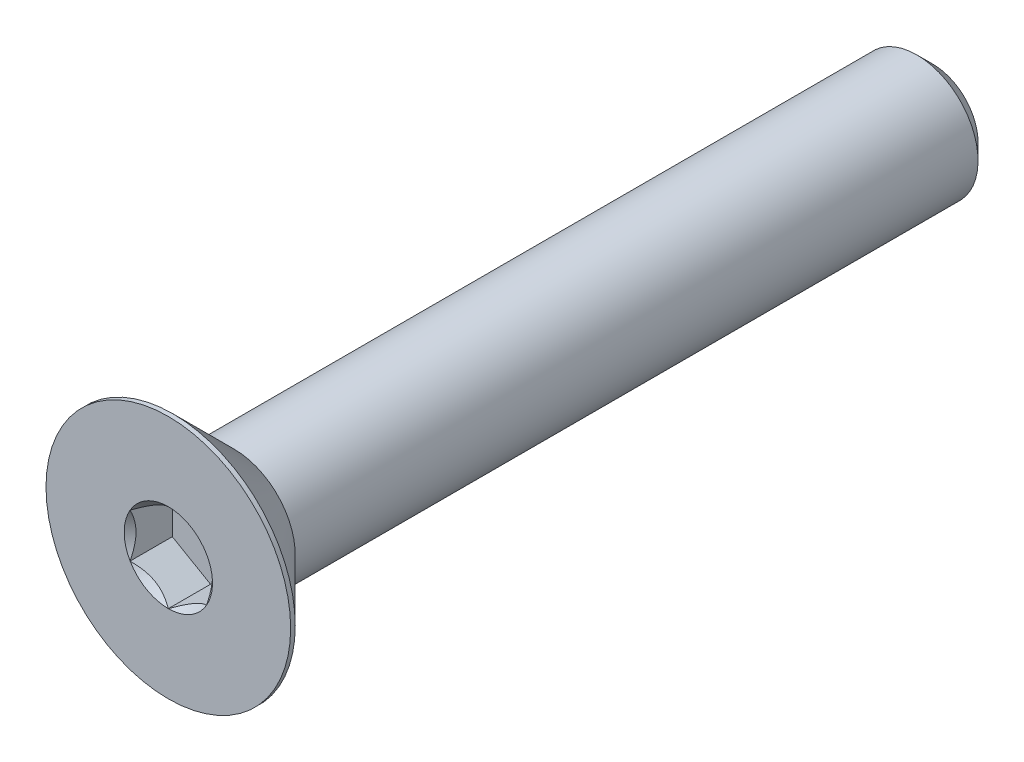
ISO-10303-21;
HEADER;
FILE_DESCRIPTION(('STEP AP214'),'2;1');
FILE_NAME('part.step','',(''),(''),'','','');
FILE_SCHEMA(('AUTOMOTIVE_DESIGN { 1 0 10303 214 1 1 1 1 }'));
ENDSEC;
DATA;
#1=APPLICATION_CONTEXT('core data for automotive mechanical design processes');
#2=APPLICATION_PROTOCOL_DEFINITION('international standard','automotive_design',2000,#1);
#3=PRODUCT_CONTEXT('',#1,'mechanical');
#4=PRODUCT('Part','Part','',(#3));
#5=PRODUCT_RELATED_PRODUCT_CATEGORY('part','',(#4));
#6=PRODUCT_DEFINITION_FORMATION('','',#4);
#7=PRODUCT_DEFINITION_CONTEXT('part definition',#1,'design');
#8=PRODUCT_DEFINITION('design','',#6,#7);
#9=PRODUCT_DEFINITION_SHAPE('','',#8);
#10=(LENGTH_UNIT() NAMED_UNIT(*) SI_UNIT(.MILLI.,.METRE.));
#11=(NAMED_UNIT(*) PLANE_ANGLE_UNIT() SI_UNIT($,.RADIAN.));
#12=(NAMED_UNIT(*) SI_UNIT($,.STERADIAN.) SOLID_ANGLE_UNIT());
#13=UNCERTAINTY_MEASURE_WITH_UNIT(LENGTH_MEASURE(1.E-05),#10,'distance_accuracy_value','');
#14=(GEOMETRIC_REPRESENTATION_CONTEXT(3) GLOBAL_UNCERTAINTY_ASSIGNED_CONTEXT((#13)) GLOBAL_UNIT_ASSIGNED_CONTEXT((#10,
#11,#12)) REPRESENTATION_CONTEXT('',''));
#15=CARTESIAN_POINT('',(0.,0.,0.));
#16=DIRECTION('',(0.,0.,1.));
#17=DIRECTION('',(1.,0.,0.));
#18=AXIS2_PLACEMENT_3D('',#15,#16,#17);
#19=CARTESIAN_POINT('',(0.,0.,2.3));
#20=DIRECTION('',(0.,0.,1.));
#21=DIRECTION('',(0.,-1.,0.));
#22=AXIS2_PLACEMENT_3D('',#19,#20,#21);
#23=PLANE('',#22);
#24=CARTESIAN_POINT('',(0.,0.,2.3));
#25=DIRECTION('',(0.,0.,1.));
#26=DIRECTION('',(1.,0.,0.));
#27=AXIS2_PLACEMENT_3D('',#24,#25,#26);
#28=CIRCLE('',#27,1.44337567297406);
#29=CARTESIAN_POINT('',(0.,-1.44337567297406,2.3));
#30=VERTEX_POINT('',#29);
#31=CARTESIAN_POINT('',(1.24999999999999,-0.721687836487047,2.3));
#32=VERTEX_POINT('',#31);
#33=EDGE_CURVE('E104',#30,#32,#28,.T.);
#34=ORIENTED_EDGE('',*,*,#33,.F.);
#35=CARTESIAN_POINT('',(-1.25,-0.721687836487038,2.3));
#36=VERTEX_POINT('',#35);
#37=EDGE_CURVE('E93',#36,#30,#28,.T.);
#38=ORIENTED_EDGE('',*,*,#37,.F.);
#39=CARTESIAN_POINT('',(-1.25,0.72168783648703,2.3));
#40=VERTEX_POINT('',#39);
#41=EDGE_CURVE('E101',#40,#36,#28,.T.);
#42=ORIENTED_EDGE('',*,*,#41,.F.);
#43=CARTESIAN_POINT('',(0.,1.44337567297406,2.3));
#44=VERTEX_POINT('',#43);
#45=EDGE_CURVE('E53',#44,#40,#28,.T.);
#46=ORIENTED_EDGE('',*,*,#45,.F.);
#47=CARTESIAN_POINT('',(1.25,0.72168783648702,2.3));
#48=VERTEX_POINT('',#47);
#49=EDGE_CURVE('E61',#48,#44,#28,.T.);
#50=ORIENTED_EDGE('',*,*,#49,.F.);
#51=EDGE_CURVE('E132',#32,#48,#28,.T.);
#52=ORIENTED_EDGE('',*,*,#51,.F.);
#53=EDGE_LOOP('',(#34,#38,#42,#46,#50,#52));
#54=FACE_BOUND('',#53,.T.);
#55=CARTESIAN_POINT('',(0.,0.,2.3));
#56=DIRECTION('',(0.,0.,-1.));
#57=DIRECTION('',(0.,1.,0.));
#58=AXIS2_PLACEMENT_3D('',#55,#56,#57);
#59=CIRCLE('',#58,4.);
#60=CARTESIAN_POINT('',(0.,4.,2.3));
#61=VERTEX_POINT('',#60);
#62=EDGE_CURVE('E11',#61,#61,#59,.T.);
#63=ORIENTED_EDGE('',*,*,#62,.F.);
#64=EDGE_LOOP('',(#63));
#65=FACE_BOUND('',#64,.T.);
#66=ADVANCED_FACE('F41',(#54,#65),#23,.T.);
#67=CARTESIAN_POINT('',(0.,0.,-22.7));
#68=DIRECTION('',(0.,0.,-1.));
#69=DIRECTION('',(0.,1.,0.));
#70=AXIS2_PLACEMENT_3D('',#67,#68,#69);
#71=CYLINDRICAL_SURFACE('',#70,4.);
#72=ORIENTED_EDGE('',*,*,#62,.T.);
#73=EDGE_LOOP('',(#72));
#74=FACE_BOUND('',#73,.T.);
#75=CARTESIAN_POINT('',(0.,0.,2.15000000000001));
#76=DIRECTION('',(0.,0.,-1.));
#77=DIRECTION('',(0.,1.,0.));
#78=AXIS2_PLACEMENT_3D('',#75,#76,#77);
#79=CIRCLE('',#78,4.);
#80=CARTESIAN_POINT('',(0.,4.,2.15000000000001));
#81=VERTEX_POINT('',#80);
#82=EDGE_CURVE('E48',#81,#81,#79,.T.);
#83=ORIENTED_EDGE('',*,*,#82,.F.);
#84=EDGE_LOOP('',(#83));
#85=FACE_BOUND('',#84,.T.);
#86=ADVANCED_FACE('F202',(#74,#85),#71,.T.);
#87=CARTESIAN_POINT('',(0.,0.,0.14999999999999));
#88=DIRECTION('',(0.,0.,1.));
#89=DIRECTION('',(0.,-1.,0.));
#90=AXIS2_PLACEMENT_3D('',#87,#88,#89);
#91=CONICAL_SURFACE('',#90,2.,0.785398163397443);
#92=ORIENTED_EDGE('',*,*,#82,.T.);
#93=EDGE_LOOP('',(#92));
#94=FACE_BOUND('',#93,.T.);
#95=CARTESIAN_POINT('',(0.,0.,0.14999999999999));
#96=DIRECTION('',(0.,0.,-1.));
#97=DIRECTION('',(0.,1.,0.));
#98=AXIS2_PLACEMENT_3D('',#95,#96,#97);
#99=CIRCLE('',#98,2.);
#100=CARTESIAN_POINT('',(0.,2.,0.14999999999999));
#101=VERTEX_POINT('',#100);
#102=EDGE_CURVE('E342',#101,#101,#99,.T.);
#103=ORIENTED_EDGE('',*,*,#102,.F.);
#104=EDGE_LOOP('',(#103));
#105=FACE_BOUND('',#104,.T.);
#106=ADVANCED_FACE('F211',(#94,#105),#91,.T.);
#107=CARTESIAN_POINT('',(0.,0.,-22.7));
#108=DIRECTION('',(0.,0.,-1.));
#109=DIRECTION('',(0.,1.,0.));
#110=AXIS2_PLACEMENT_3D('',#107,#108,#109);
#111=CYLINDRICAL_SURFACE('',#110,2.);
#112=ORIENTED_EDGE('',*,*,#102,.T.);
#113=EDGE_LOOP('',(#112));
#114=FACE_BOUND('',#113,.T.);
#115=CARTESIAN_POINT('',(0.,0.,-22.175));
#116=DIRECTION('',(0.,0.,-1.));
#117=DIRECTION('',(0.,1.,0.));
#118=AXIS2_PLACEMENT_3D('',#115,#116,#117);
#119=CIRCLE('',#118,2.);
#120=CARTESIAN_POINT('',(0.,2.,-22.175));
#121=VERTEX_POINT('',#120);
#122=EDGE_CURVE('E339',#121,#121,#119,.T.);
#123=ORIENTED_EDGE('',*,*,#122,.F.);
#124=EDGE_LOOP('',(#123));
#125=FACE_BOUND('',#124,.T.);
#126=ADVANCED_FACE('F218',(#114,#125),#111,.T.);
#127=CARTESIAN_POINT('',(0.,0.,-22.7));
#128=DIRECTION('',(0.,0.,1.));
#129=DIRECTION('',(0.,-1.,0.));
#130=AXIS2_PLACEMENT_3D('',#127,#128,#129);
#131=CONICAL_SURFACE('',#130,1.475,0.785398163397455);
#132=ORIENTED_EDGE('',*,*,#122,.T.);
#133=EDGE_LOOP('',(#132));
#134=FACE_BOUND('',#133,.T.);
#135=CARTESIAN_POINT('',(0.,0.,-22.7));
#136=DIRECTION('',(0.,0.,-1.));
#137=DIRECTION('',(0.,1.,0.));
#138=AXIS2_PLACEMENT_3D('',#135,#136,#137);
#139=CIRCLE('',#138,1.475);
#140=CARTESIAN_POINT('',(0.,1.475,-22.7));
#141=VERTEX_POINT('',#140);
#142=EDGE_CURVE('E326',#141,#141,#139,.T.);
#143=ORIENTED_EDGE('',*,*,#142,.F.);
#144=EDGE_LOOP('',(#143));
#145=FACE_BOUND('',#144,.T.);
#146=ADVANCED_FACE('F225',(#134,#145),#131,.T.);
#147=CARTESIAN_POINT('',(0.,1.475,-22.7));
#148=DIRECTION('',(0.,0.,-1.));
#149=DIRECTION('',(0.,1.,0.));
#150=AXIS2_PLACEMENT_3D('',#147,#148,#149);
#151=PLANE('',#150);
#152=ORIENTED_EDGE('',*,*,#142,.T.);
#153=EDGE_LOOP('',(#152));
#154=FACE_BOUND('',#153,.T.);
#155=ADVANCED_FACE('F227',(#154),#151,.T.);
#156=CARTESIAN_POINT('',(0.,0.,2.3));
#157=DIRECTION('',(0.,0.,1.));
#158=DIRECTION('',(1.,0.,0.));
#159=AXIS2_PLACEMENT_3D('',#156,#157,#158);
#160=CONICAL_SURFACE('',#159,1.44337567297406,0.78539816339745);
#161=ORIENTED_EDGE('',*,*,#33,.T.);
#162=CARTESIAN_POINT('',(-0.000199999999999298,-1.44349114302791,2.30011548390915));
#163=CARTESIAN_POINT('',(0.0427751670715876,-1.41867941875066,2.27532166805511));
#164=CARTESIAN_POINT('',(0.0864690047459491,-1.39345276980744,2.25198373441869));
#165=CARTESIAN_POINT('',(0.175565930841943,-1.34201263554195,2.20925200408455));
#166=CARTESIAN_POINT('',(0.220977498357065,-1.31579425481277,2.18988199236042));
#167=CARTESIAN_POINT('',(0.312547820935262,-1.26292610442247,2.15670048341349));
#168=CARTESIAN_POINT('',(0.358683240175887,-1.23628980770471,2.14280555905267));
#169=CARTESIAN_POINT('',(0.451970080407595,-1.18243062538509,2.12139728216065));
#170=CARTESIAN_POINT('',(0.499118649136382,-1.15520938653762,2.1138679415668));
#171=CARTESIAN_POINT('',(0.580373556887255,-1.10829684367467,2.10707449805071));
#172=CARTESIAN_POINT('',(0.614374876627943,-1.08866617256958,2.10606855910436));
#173=CARTESIAN_POINT('',(0.68231776443248,-1.04943932800611,2.10776141491133));
#174=CARTESIAN_POINT('',(0.71625931765566,-1.029843163116,2.11046102721555));
#175=CARTESIAN_POINT('',(0.783814856457503,-0.990839954603503,2.11940893031639));
#176=CARTESIAN_POINT('',(0.817428507286778,-0.971433104248775,2.12566052589972));
#177=CARTESIAN_POINT('',(0.884094638217817,-0.932943395609909,2.14137568141391));
#178=CARTESIAN_POINT('',(0.917146871030299,-0.913860680098304,2.15084062008747));
#179=CARTESIAN_POINT('',(1.00179969160027,-0.864986351354572,2.1789313906876));
#180=CARTESIAN_POINT('',(1.05286649242964,-0.83550292014908,2.19967015745221));
#181=CARTESIAN_POINT('',(1.15300085411326,-0.777690319475913,2.24638713467148));
#182=CARTESIAN_POINT('',(1.20207431157827,-0.749357745598422,2.27234829594677));
#183=CARTESIAN_POINT('',(1.2502,-0.7215723664332,2.30011548390914));
#184=B_SPLINE_CURVE_WITH_KNOTS('',3,(#162,#163,#164,#165,#166,#167,#168,#169,#170,#171,#172,
#173,#174,#175,#176,#177,#178,#179,#180,#181,#182,#183),.UNSPECIFIED.,.F.,.F.,(4,2,2,2,2,2,2,2,
2,2,4),(0.,0.166533409618304,0.334037607289763,0.4988803964897,0.663307919240276,
0.780963963458829,0.898645970148456,1.01643764860774,1.1342799317155,1.32148652032141,
1.50809158792574),.UNSPECIFIED.);
#185=EDGE_CURVE('E107',#30,#32,#184,.T.);
#186=ORIENTED_EDGE('',*,*,#185,.F.);
#187=EDGE_LOOP('',(#161,#186));
#188=FACE_BOUND('',#187,.T.);
#189=ADVANCED_FACE('F109',(#188),#160,.F.);
#190=ORIENTED_EDGE('',*,*,#51,.T.);
#191=CARTESIAN_POINT('',(1.25,-1.44558559085168,2.76770195508766));
#192=CARTESIAN_POINT('',(1.25,-1.41041456421273,2.74110177846586));
#193=CARTESIAN_POINT('',(1.25,-1.375048246278,2.71476055449202));
#194=CARTESIAN_POINT('',(1.25,-1.30384550652843,2.66270312278429));
#195=CARTESIAN_POINT('',(1.25,-1.26800896958643,2.63698707268499));
#196=CARTESIAN_POINT('',(1.25,-1.15915024976603,2.56057047994769));
#197=CARTESIAN_POINT('',(1.25,-1.0853135555352,2.51101105414595));
#198=CARTESIAN_POINT('',(1.25,-0.930440480136245,2.41366267450988));
#199=CARTESIAN_POINT('',(1.25,-0.849234447842946,2.36614057378199));
#200=CARTESIAN_POINT('',(1.25,-0.682758358155013,2.27917251766336));
#201=CARTESIAN_POINT('',(1.25,-0.597503250727505,2.23969932800442));
#202=CARTESIAN_POINT('',(1.25,-0.469594358717527,2.19140566309066));
#203=CARTESIAN_POINT('',(1.25,-0.428847517514854,2.17755553704108));
#204=CARTESIAN_POINT('',(1.25,-0.346364670497222,2.15312581626434));
#205=CARTESIAN_POINT('',(1.25,-0.304628597273696,2.14254644510785));
#206=CARTESIAN_POINT('',(1.25,-0.221117022160186,2.12538571480318));
#207=CARTESIAN_POINT('',(1.25,-0.179355899882148,2.11873547434159));
#208=CARTESIAN_POINT('',(1.25,-0.095380156628225,2.10956385515197));
#209=CARTESIAN_POINT('',(1.25,-0.0531656163345118,2.10704175371567));
#210=CARTESIAN_POINT('',(1.25,0.0297411153276122,2.10631616273595));
#211=CARTESIAN_POINT('',(1.25,0.0704319929081055,2.10795672790788));
#212=CARTESIAN_POINT('',(1.25,0.151471929245862,2.11512087453646));
#213=CARTESIAN_POINT('',(1.25,0.191820921364253,2.12064519614476));
#214=CARTESIAN_POINT('',(1.25,0.272562320711496,2.13536794868554));
#215=CARTESIAN_POINT('',(1.25,0.312943142675219,2.14462895456776));
#216=CARTESIAN_POINT('',(1.25,0.392821680655096,2.16633099691958));
#217=CARTESIAN_POINT('',(1.25,0.432319468115639,2.17877177510079));
#218=CARTESIAN_POINT('',(1.25,0.556389803393322,2.22253839960481));
#219=CARTESIAN_POINT('',(1.25,0.63920381751649,2.25883695565282));
#220=CARTESIAN_POINT('',(1.25,0.800943973860687,2.33955043113924));
#221=CARTESIAN_POINT('',(1.25,0.879854844337737,2.38399445277655));
#222=CARTESIAN_POINT('',(1.25,1.03066900695341,2.47569512396586));
#223=CARTESIAN_POINT('',(1.25,1.10272570486019,2.52270260556435));
#224=CARTESIAN_POINT('',(1.25,1.2088866162029,2.59537504737116));
#225=CARTESIAN_POINT('',(1.25,1.2438155557312,2.61985615718635));
#226=CARTESIAN_POINT('',(1.25,1.31319594254627,2.66946685288608));
#227=CARTESIAN_POINT('',(1.25,1.34764751766826,2.69459625979218));
#228=CARTESIAN_POINT('',(1.25,1.38190028539499,2.71999449926085));
#229=B_SPLINE_CURVE_WITH_KNOTS('',3,(#191,#192,#193,#194,#195,#196,#197,#198,#199,#200,#201,
#202,#203,#204,#205,#206,#207,#208,#209,#210,#211,#212,#213,#214,#215,#216,#217,#218,#219,#220,
#221,#222,#223,#224,#225,#226,#227,#228),.UNSPECIFIED.,.F.,.F.,(4,2,2,2,2,2,2,2,2,2,2,2,2,2,2,2,
2,2,4),(0.,0.132288510820274,0.264610038672127,0.531272225402128,0.813310106763961,
1.09437724330802,1.22337738425307,1.35238634098375,1.47906083498915,1.60571314987258,
1.72769130094315,1.84969270445304,1.97382807612636,2.09795336766269,2.36841755380881,
2.63986759286266,2.89784160186214,3.02579840704267,3.15372025683404),.UNSPECIFIED.);
#230=EDGE_CURVE('E112',#32,#48,#229,.T.);
#231=ORIENTED_EDGE('',*,*,#230,.F.);
#232=EDGE_LOOP('',(#190,#231));
#233=FACE_BOUND('',#232,.T.);
#234=ADVANCED_FACE('F277',(#233),#160,.F.);
#235=ORIENTED_EDGE('',*,*,#49,.T.);
#236=CARTESIAN_POINT('',(1.2502,0.721572366433189,2.30011548390914));
#237=CARTESIAN_POINT('',(1.20722483292841,0.746384090710439,2.27532166805511));
#238=CARTESIAN_POINT('',(1.16353099525405,0.771610739653659,2.25198373441869));
#239=CARTESIAN_POINT('',(1.07443406915806,0.823050873919149,2.20925200408454));
#240=CARTESIAN_POINT('',(1.02902250164294,0.849269254648328,2.18988199236042));
#241=CARTESIAN_POINT('',(0.93745217906474,0.902137405038631,2.15670048341348));
#242=CARTESIAN_POINT('',(0.891316759824114,0.928773701756382,2.14280555905266));
#243=CARTESIAN_POINT('',(0.798029919592407,0.982632884076008,2.12139728216064));
#244=CARTESIAN_POINT('',(0.75088135086362,1.00985412292348,2.11386794156679));
#245=CARTESIAN_POINT('',(0.669626443112747,1.05676666578642,2.1070744980507));
#246=CARTESIAN_POINT('',(0.635625123372059,1.07639733689151,2.10606855910435));
#247=CARTESIAN_POINT('',(0.567682235567522,1.11562418145498,2.10776141491132));
#248=CARTESIAN_POINT('',(0.533740682344342,1.1352203463451,2.11046102721554));
#249=CARTESIAN_POINT('',(0.4661851435425,1.17422355485759,2.11940893031638));
#250=CARTESIAN_POINT('',(0.432571492713225,1.19363040521232,2.12566052589971));
#251=CARTESIAN_POINT('',(0.365905361782187,1.23212011385119,2.1413756814139));
#252=CARTESIAN_POINT('',(0.332853128969705,1.25120282936279,2.15084062008746));
#253=CARTESIAN_POINT('',(0.248200308399736,1.30007715810652,2.17893139068759));
#254=CARTESIAN_POINT('',(0.197133507570362,1.32956058931202,2.1996701574522));
#255=CARTESIAN_POINT('',(0.0969991458867458,1.38737318998518,2.24638713467148));
#256=CARTESIAN_POINT('',(0.0479256884217311,1.41570576386268,2.27234829594677));
#257=CARTESIAN_POINT('',(-0.000199999999999493,1.4434911430279,2.30011548390914));
#258=B_SPLINE_CURVE_WITH_KNOTS('',3,(#236,#237,#238,#239,#240,#241,#242,#243,#244,#245,#246,
#247,#248,#249,#250,#251,#252,#253,#254,#255,#256,#257),.UNSPECIFIED.,.F.,.F.,(4,2,2,2,2,2,2,2,
2,2,4),(0.,0.166533409618304,0.334037607289763,0.4988803964897,0.663307919240277,
0.780963963458829,0.898645970148455,1.01643764860773,1.1342799317155,1.32148652032141,
1.50809158792574),.UNSPECIFIED.);
#259=EDGE_CURVE('E162',#48,#44,#258,.T.);
#260=ORIENTED_EDGE('',*,*,#259,.F.);
#261=EDGE_LOOP('',(#235,#260));
#262=FACE_BOUND('',#261,.T.);
#263=ADVANCED_FACE('F282',(#262),#160,.F.);
#264=ORIENTED_EDGE('',*,*,#45,.T.);
#265=CARTESIAN_POINT('',(0.000200000000000505,1.4434911430279,2.30011548390914));
#266=CARTESIAN_POINT('',(-0.0427751670715859,1.41867941875065,2.2753216680551));
#267=CARTESIAN_POINT('',(-0.0864690047459471,1.39345276980743,2.25198373441868));
#268=CARTESIAN_POINT('',(-0.175565930841941,1.34201263554194,2.20925200408454));
#269=CARTESIAN_POINT('',(-0.220977498357063,1.31579425481276,2.18988199236041));
#270=CARTESIAN_POINT('',(-0.312547820935258,1.26292610442246,2.15670048341348));
#271=CARTESIAN_POINT('',(-0.358683240175884,1.23628980770471,2.14280555905266));
#272=CARTESIAN_POINT('',(-0.45197008040759,1.18243062538508,2.12139728216064));
#273=CARTESIAN_POINT('',(-0.499118649136378,1.15520938653761,2.11386794156679));
#274=CARTESIAN_POINT('',(-0.58037355688725,1.10829684367466,2.1070744980507));
#275=CARTESIAN_POINT('',(-0.614374876627938,1.08866617256958,2.10606855910435));
#276=CARTESIAN_POINT('',(-0.682317764432475,1.04943932800611,2.10776141491132));
#277=CARTESIAN_POINT('',(-0.716259317655655,1.02984316311599,2.11046102721554));
#278=CARTESIAN_POINT('',(-0.783814856457496,0.990839954603496,2.11940893031638));
#279=CARTESIAN_POINT('',(-0.817428507286771,0.971433104248768,2.12566052589971));
#280=CARTESIAN_POINT('',(-0.884094638217809,0.932943395609902,2.1413756814139));
#281=CARTESIAN_POINT('',(-0.917146871030292,0.913860680098297,2.15084062008746));
#282=CARTESIAN_POINT('',(-1.00179969160026,0.864986351354564,2.17893139068759));
#283=CARTESIAN_POINT('',(-1.05286649242964,0.835502920149072,2.1996701574522));
#284=CARTESIAN_POINT('',(-1.15300085411325,0.777690319475905,2.24638713467148));
#285=CARTESIAN_POINT('',(-1.20207431157827,0.749357745598413,2.27234829594677));
#286=CARTESIAN_POINT('',(-1.2502,0.72157236643319,2.30011548390914));
#287=B_SPLINE_CURVE_WITH_KNOTS('',3,(#265,#266,#267,#268,#269,#270,#271,#272,#273,#274,#275,
#276,#277,#278,#279,#280,#281,#282,#283,#284,#285,#286),.UNSPECIFIED.,.F.,.F.,(4,2,2,2,2,2,2,2,
2,2,4),(0.,0.166533409618303,0.33403760728976,0.498880396489696,0.663307919240272,
0.780963963458824,0.89864597014845,1.01643764860773,1.13427993171549,1.32148652032141,
1.50809158792573),.UNSPECIFIED.);
#288=EDGE_CURVE('E169',#44,#40,#287,.T.);
#289=ORIENTED_EDGE('',*,*,#288,.F.);
#290=EDGE_LOOP('',(#264,#289));
#291=FACE_BOUND('',#290,.T.);
#292=ADVANCED_FACE('F295',(#291),#160,.F.);
#293=ORIENTED_EDGE('',*,*,#41,.T.);
#294=CARTESIAN_POINT('',(-1.25,-1.44558559085168,2.76770195508766));
#295=CARTESIAN_POINT('',(-1.25,-1.41041456421273,2.74110177846586));
#296=CARTESIAN_POINT('',(-1.25,-1.37504824627801,2.71476055449202));
#297=CARTESIAN_POINT('',(-1.25,-1.30384550652843,2.66270312278429));
#298=CARTESIAN_POINT('',(-1.25,-1.26800896958644,2.63698707268499));
#299=CARTESIAN_POINT('',(-1.25,-1.15915024976603,2.56057047994769));
#300=CARTESIAN_POINT('',(-1.25,-1.0853135555352,2.51101105414595));
#301=CARTESIAN_POINT('',(-1.25,-0.930440480136247,2.41366267450988));
#302=CARTESIAN_POINT('',(-1.25,-0.849234447842947,2.36614057378199));
#303=CARTESIAN_POINT('',(-1.25,-0.682758358155014,2.27917251766336));
#304=CARTESIAN_POINT('',(-1.25,-0.597503250727506,2.23969932800442));
#305=CARTESIAN_POINT('',(-1.25,-0.469594358717527,2.19140566309066));
#306=CARTESIAN_POINT('',(-1.25,-0.428847517514855,2.17755553704108));
#307=CARTESIAN_POINT('',(-1.25,-0.346364670497223,2.15312581626434));
#308=CARTESIAN_POINT('',(-1.25,-0.304628597273696,2.14254644510784));
#309=CARTESIAN_POINT('',(-1.25,-0.221117022160187,2.12538571480318));
#310=CARTESIAN_POINT('',(-1.25,-0.179355899882149,2.11873547434159));
#311=CARTESIAN_POINT('',(-1.25,-0.0953801566282258,2.10956385515197));
#312=CARTESIAN_POINT('',(-1.25,-0.0531656163345126,2.10704175371567));
#313=CARTESIAN_POINT('',(-1.25,0.0297411153276114,2.10631616273595));
#314=CARTESIAN_POINT('',(-1.25,0.0704319929081049,2.10795672790787));
#315=CARTESIAN_POINT('',(-1.25,0.151471929245861,2.11512087453645));
#316=CARTESIAN_POINT('',(-1.25,0.191820921364252,2.12064519614475));
#317=CARTESIAN_POINT('',(-1.25,0.272562320711495,2.13536794868554));
#318=CARTESIAN_POINT('',(-1.25,0.312943142675218,2.14462895456776));
#319=CARTESIAN_POINT('',(-1.25,0.392821680655095,2.16633099691957));
#320=CARTESIAN_POINT('',(-1.25,0.432319468115638,2.17877177510079));
#321=CARTESIAN_POINT('',(-1.25,0.556389803393322,2.2225383996048));
#322=CARTESIAN_POINT('',(-1.25,0.639203817516489,2.25883695565282));
#323=CARTESIAN_POINT('',(-1.25,0.800943973860685,2.33955043113924));
#324=CARTESIAN_POINT('',(-1.25,0.879854844337736,2.38399445277655));
#325=CARTESIAN_POINT('',(-1.25,1.03066900695341,2.47569512396586));
#326=CARTESIAN_POINT('',(-1.25,1.10272570486019,2.52270260556435));
#327=CARTESIAN_POINT('',(-1.25,1.20888661620289,2.59537504737116));
#328=CARTESIAN_POINT('',(-1.25,1.24381555573119,2.61985615718635));
#329=CARTESIAN_POINT('',(-1.25,1.31319594254627,2.66946685288607));
#330=CARTESIAN_POINT('',(-1.25,1.34764751766826,2.69459625979218));
#331=CARTESIAN_POINT('',(-1.25,1.38190028539498,2.71999449926084));
#332=B_SPLINE_CURVE_WITH_KNOTS('',3,(#294,#295,#296,#297,#298,#299,#300,#301,#302,#303,#304,
#305,#306,#307,#308,#309,#310,#311,#312,#313,#314,#315,#316,#317,#318,#319,#320,#321,#322,#323,
#324,#325,#326,#327,#328,#329,#330,#331),.UNSPECIFIED.,.F.,.F.,(4,2,2,2,2,2,2,2,2,2,2,2,2,2,2,2,
2,2,4),(0.,0.132288510820275,0.264610038672127,0.531272225402128,0.813310106763961,
1.09437724330802,1.22337738425308,1.35238634098375,1.47906083498915,1.60571314987258,
1.72769130094315,1.84969270445304,1.97382807612636,2.09795336766269,2.36841755380881,
2.63986759286266,2.89784160186214,3.02579840704267,3.15372025683404),.UNSPECIFIED.);
#333=EDGE_CURVE('E121',#40,#36,#332,.F.);
#334=ORIENTED_EDGE('',*,*,#333,.F.);
#335=EDGE_LOOP('',(#293,#334));
#336=FACE_BOUND('',#335,.T.);
#337=ADVANCED_FACE('F152',(#336),#160,.F.);
#338=ORIENTED_EDGE('',*,*,#37,.T.);
#339=CARTESIAN_POINT('',(-1.2502,-0.7215723664332,2.30011548390914));
#340=CARTESIAN_POINT('',(-1.20722483292841,-0.74638409071045,2.27532166805511));
#341=CARTESIAN_POINT('',(-1.16353099525405,-0.77161073965367,2.25198373441869));
#342=CARTESIAN_POINT('',(-1.07443406915806,-0.82305087391916,2.20925200408454));
#343=CARTESIAN_POINT('',(-1.02902250164294,-0.849269254648338,2.18988199236042));
#344=CARTESIAN_POINT('',(-0.93745217906474,-0.902137405038641,2.15670048341349));
#345=CARTESIAN_POINT('',(-0.891316759824115,-0.928773701756392,2.14280555905267));
#346=CARTESIAN_POINT('',(-0.798029919592408,-0.982632884076017,2.12139728216065));
#347=CARTESIAN_POINT('',(-0.750881350863621,-1.00985412292349,2.1138679415668));
#348=CARTESIAN_POINT('',(-0.669626443112749,-1.05676666578643,2.10707449805071));
#349=CARTESIAN_POINT('',(-0.63562512337206,-1.07639733689152,2.10606855910436));
#350=CARTESIAN_POINT('',(-0.567682235567523,-1.11562418145499,2.10776141491133));
#351=CARTESIAN_POINT('',(-0.533740682344343,-1.13522034634511,2.11046102721555));
#352=CARTESIAN_POINT('',(-0.466185143542501,-1.1742235548576,2.11940893031639));
#353=CARTESIAN_POINT('',(-0.432571492713225,-1.19363040521233,2.12566052589972));
#354=CARTESIAN_POINT('',(-0.365905361782187,-1.2321201138512,2.14137568141391));
#355=CARTESIAN_POINT('',(-0.332853128969704,-1.2512028293628,2.15084062008747));
#356=CARTESIAN_POINT('',(-0.248200308399735,-1.30007715810653,2.1789313906876));
#357=CARTESIAN_POINT('',(-0.197133507570361,-1.32956058931203,2.19967015745221));
#358=CARTESIAN_POINT('',(-0.0969991458867445,-1.38737318998519,2.24638713467149));
#359=CARTESIAN_POINT('',(-0.0479256884217297,-1.41570576386269,2.27234829594678));
#360=CARTESIAN_POINT('',(0.000200000000000935,-1.44349114302791,2.30011548390915));
#361=B_SPLINE_CURVE_WITH_KNOTS('',3,(#339,#340,#341,#342,#343,#344,#345,#346,#347,#348,#349,
#350,#351,#352,#353,#354,#355,#356,#357,#358,#359,#360),.UNSPECIFIED.,.F.,.F.,(4,2,2,2,2,2,2,2,
2,2,4),(0.,0.166533409618303,0.33403760728976,0.498880396489696,0.663307919240271,
0.780963963458824,0.898645970148451,1.01643764860773,1.13427993171549,1.32148652032141,
1.50809158792574),.UNSPECIFIED.);
#362=EDGE_CURVE('E96',#36,#30,#361,.T.);
#363=ORIENTED_EDGE('',*,*,#362,.F.);
#364=EDGE_LOOP('',(#338,#363));
#365=FACE_BOUND('',#364,.T.);
#366=ADVANCED_FACE('F98',(#365),#160,.F.);
#367=CARTESIAN_POINT('',(0.,-1.44337567297407,0.92));
#368=DIRECTION('',(0.,0.,1.));
#369=DIRECTION('',(1.,0.,0.));
#370=AXIS2_PLACEMENT_3D('',#367,#368,#369);
#371=PLANE('',#370);
#372=DIRECTION('',(0.866025403784439,-0.5,0.));
#373=VECTOR('',#372,1.);
#374=CARTESIAN_POINT('',(-1.25,-0.721687836487038,0.92));
#375=LINE('',#374,#373);
#376=CARTESIAN_POINT('',(-1.25,-0.721687836487038,0.92));
#377=VERTEX_POINT('',#376);
#378=CARTESIAN_POINT('',(0.,-1.44337567297407,0.92));
#379=VERTEX_POINT('',#378);
#380=EDGE_CURVE('E124',#377,#379,#375,.T.);
#381=ORIENTED_EDGE('',*,*,#380,.T.);
#382=DIRECTION('',(0.866025403784439,0.5,0.));
#383=VECTOR('',#382,1.);
#384=CARTESIAN_POINT('',(0.,-1.44337567297407,0.92));
#385=LINE('',#384,#383);
#386=CARTESIAN_POINT('',(1.25,-0.721687836487038,0.92));
#387=VERTEX_POINT('',#386);
#388=EDGE_CURVE('E129',#379,#387,#385,.T.);
#389=ORIENTED_EDGE('',*,*,#388,.T.);
#390=DIRECTION('',(0.,1.,0.));
#391=VECTOR('',#390,1.);
#392=CARTESIAN_POINT('',(1.25,-0.721687836487038,0.92));
#393=LINE('',#392,#391);
#394=CARTESIAN_POINT('',(1.25,0.721687836487027,0.92));
#395=VERTEX_POINT('',#394);
#396=EDGE_CURVE('E352',#387,#395,#393,.T.);
#397=ORIENTED_EDGE('',*,*,#396,.T.);
#398=DIRECTION('',(-0.866025403784438,0.5,0.));
#399=VECTOR('',#398,1.);
#400=CARTESIAN_POINT('',(1.25,0.721687836487027,0.92));
#401=LINE('',#400,#399);
#402=CARTESIAN_POINT('',(0.,1.44337567297406,0.92));
#403=VERTEX_POINT('',#402);
#404=EDGE_CURVE('E356',#395,#403,#401,.T.);
#405=ORIENTED_EDGE('',*,*,#404,.T.);
#406=DIRECTION('',(-0.866025403784439,-0.5,0.));
#407=VECTOR('',#406,1.);
#408=CARTESIAN_POINT('',(0.,1.44337567297406,0.92));
#409=LINE('',#408,#407);
#410=CARTESIAN_POINT('',(-1.25,0.721687836487028,0.92));
#411=VERTEX_POINT('',#410);
#412=EDGE_CURVE('E361',#403,#411,#409,.T.);
#413=ORIENTED_EDGE('',*,*,#412,.T.);
#414=DIRECTION('',(0.,-1.,0.));
#415=VECTOR('',#414,1.);
#416=CARTESIAN_POINT('',(-1.25,0.721687836487028,0.92));
#417=LINE('',#416,#415);
#418=EDGE_CURVE('E133',#411,#377,#417,.T.);
#419=ORIENTED_EDGE('',*,*,#418,.T.);
#420=EDGE_LOOP('',(#381,#389,#397,#405,#413,#419));
#421=FACE_BOUND('',#420,.T.);
#422=ADVANCED_FACE('F154',(#421),#371,.T.);
#423=CARTESIAN_POINT('',(0.,-1.44337567297407,0.92));
#424=DIRECTION('',(0.5,-0.866025403784439,0.));
#425=DIRECTION('',(0.866025403784439,0.5,0.));
#426=AXIS2_PLACEMENT_3D('',#423,#424,#425);
#427=PLANE('',#426);
#428=DIRECTION('',(0.,0.,1.));
#429=VECTOR('',#428,1.);
#430=CARTESIAN_POINT('',(0.,-1.44337567297407,0.92));
#431=LINE('',#430,#429);
#432=EDGE_CURVE('E118',#379,#30,#431,.T.);
#433=ORIENTED_EDGE('',*,*,#432,.T.);
#434=ORIENTED_EDGE('',*,*,#185,.T.);
#435=DIRECTION('',(0.,0.,1.));
#436=VECTOR('',#435,1.);
#437=CARTESIAN_POINT('',(1.25,-0.721687836487038,0.92));
#438=LINE('',#437,#436);
#439=EDGE_CURVE('E130',#387,#32,#438,.T.);
#440=ORIENTED_EDGE('',*,*,#439,.F.);
#441=ORIENTED_EDGE('',*,*,#388,.F.);
#442=EDGE_LOOP('',(#433,#434,#440,#441));
#443=FACE_BOUND('',#442,.T.);
#444=ADVANCED_FACE('F126',(#443),#427,.F.);
#445=CARTESIAN_POINT('',(1.25,-0.721687836487038,0.92));
#446=DIRECTION('',(1.,0.,0.));
#447=DIRECTION('',(0.,0.,-1.));
#448=AXIS2_PLACEMENT_3D('',#445,#446,#447);
#449=PLANE('',#448);
#450=ORIENTED_EDGE('',*,*,#439,.T.);
#451=ORIENTED_EDGE('',*,*,#230,.T.);
#452=DIRECTION('',(0.,0.,1.));
#453=VECTOR('',#452,1.);
#454=CARTESIAN_POINT('',(1.25,0.721687836487027,0.92));
#455=LINE('',#454,#453);
#456=EDGE_CURVE('E327',#395,#48,#455,.T.);
#457=ORIENTED_EDGE('',*,*,#456,.F.);
#458=ORIENTED_EDGE('',*,*,#396,.F.);
#459=EDGE_LOOP('',(#450,#451,#457,#458));
#460=FACE_BOUND('',#459,.T.);
#461=ADVANCED_FACE('F198',(#460),#449,.F.);
#462=CARTESIAN_POINT('',(1.25,0.721687836487027,0.92));
#463=DIRECTION('',(0.5,0.866025403784439,0.));
#464=DIRECTION('',(-0.866025403784439,0.5,0.));
#465=AXIS2_PLACEMENT_3D('',#462,#463,#464);
#466=PLANE('',#465);
#467=ORIENTED_EDGE('',*,*,#456,.T.);
#468=ORIENTED_EDGE('',*,*,#259,.T.);
#469=DIRECTION('',(0.,0.,1.));
#470=VECTOR('',#469,1.);
#471=CARTESIAN_POINT('',(0.,1.44337567297406,0.92));
#472=LINE('',#471,#470);
#473=EDGE_CURVE('E324',#403,#44,#472,.T.);
#474=ORIENTED_EDGE('',*,*,#473,.F.);
#475=ORIENTED_EDGE('',*,*,#404,.F.);
#476=EDGE_LOOP('',(#467,#468,#474,#475));
#477=FACE_BOUND('',#476,.T.);
#478=ADVANCED_FACE('F192',(#477),#466,.F.);
#479=CARTESIAN_POINT('',(0.,1.44337567297406,0.92));
#480=DIRECTION('',(-0.5,0.866025403784439,0.));
#481=DIRECTION('',(-0.866025403784439,-0.5,0.));
#482=AXIS2_PLACEMENT_3D('',#479,#480,#481);
#483=PLANE('',#482);
#484=ORIENTED_EDGE('',*,*,#473,.T.);
#485=ORIENTED_EDGE('',*,*,#288,.T.);
#486=DIRECTION('',(0.,0.,1.));
#487=VECTOR('',#486,1.);
#488=CARTESIAN_POINT('',(-1.25,0.721687836487028,0.92));
#489=LINE('',#488,#487);
#490=EDGE_CURVE('E321',#411,#40,#489,.T.);
#491=ORIENTED_EDGE('',*,*,#490,.F.);
#492=ORIENTED_EDGE('',*,*,#412,.F.);
#493=EDGE_LOOP('',(#484,#485,#491,#492));
#494=FACE_BOUND('',#493,.T.);
#495=ADVANCED_FACE('F189',(#494),#483,.F.);
#496=CARTESIAN_POINT('',(-1.25,0.721687836487028,0.92));
#497=DIRECTION('',(-1.,0.,0.));
#498=DIRECTION('',(0.,-1.,0.));
#499=AXIS2_PLACEMENT_3D('',#496,#497,#498);
#500=PLANE('',#499);
#501=ORIENTED_EDGE('',*,*,#490,.T.);
#502=ORIENTED_EDGE('',*,*,#333,.T.);
#503=DIRECTION('',(0.,0.,1.));
#504=VECTOR('',#503,1.);
#505=CARTESIAN_POINT('',(-1.25,-0.721687836487038,0.92));
#506=LINE('',#505,#504);
#507=EDGE_CURVE('E122',#377,#36,#506,.T.);
#508=ORIENTED_EDGE('',*,*,#507,.F.);
#509=ORIENTED_EDGE('',*,*,#418,.F.);
#510=EDGE_LOOP('',(#501,#502,#508,#509));
#511=FACE_BOUND('',#510,.T.);
#512=ADVANCED_FACE('F184',(#511),#500,.F.);
#513=CARTESIAN_POINT('',(-1.25,-0.721687836487038,0.92));
#514=DIRECTION('',(-0.5,-0.866025403784439,0.));
#515=DIRECTION('',(0.866025403784439,-0.5,0.));
#516=AXIS2_PLACEMENT_3D('',#513,#514,#515);
#517=PLANE('',#516);
#518=ORIENTED_EDGE('',*,*,#507,.T.);
#519=ORIENTED_EDGE('',*,*,#362,.T.);
#520=ORIENTED_EDGE('',*,*,#432,.F.);
#521=ORIENTED_EDGE('',*,*,#380,.F.);
#522=EDGE_LOOP('',(#518,#519,#520,#521));
#523=FACE_BOUND('',#522,.T.);
#524=ADVANCED_FACE('F120',(#523),#517,.F.);
#525=CLOSED_SHELL('',(#66,#86,#106,#126,#146,#155,#189,#234,#263,#292,#337,#366,#422,#444,#461,
#478,#495,#512,#524));
#526=MANIFOLD_SOLID_BREP('B2',#525);
#527=ADVANCED_BREP_SHAPE_REPRESENTATION('',(#18,#526),#14);
#528=SHAPE_DEFINITION_REPRESENTATION(#9,#527);
ENDSEC;
END-ISO-10303-21;
